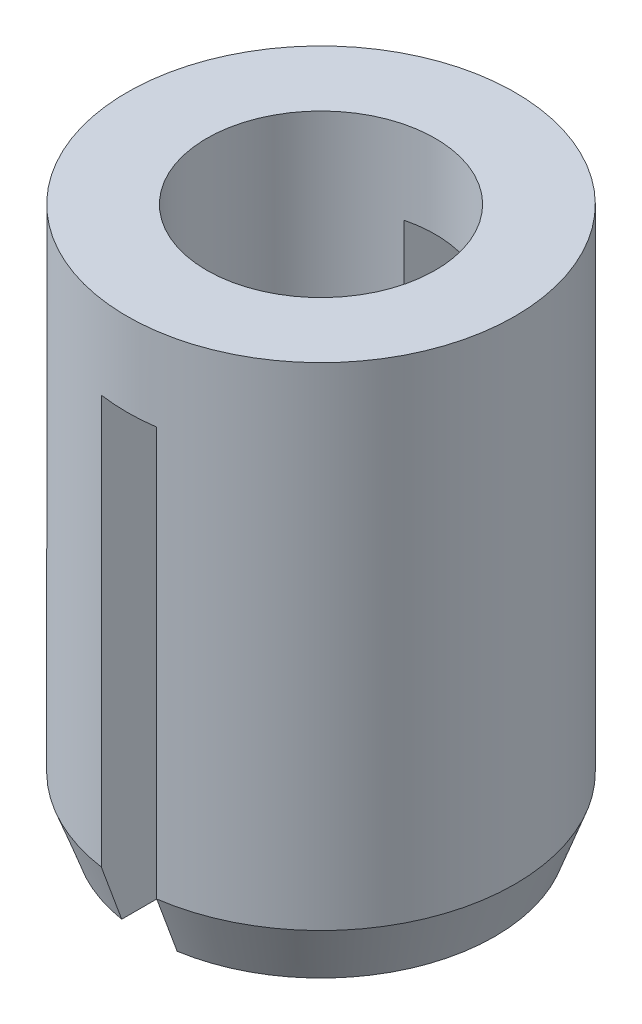
ISO-10303-21;
HEADER;
FILE_DESCRIPTION(('STEP AP214'),'2;1');
FILE_NAME('part.step','',(''),(''),'','','');
FILE_SCHEMA(('AUTOMOTIVE_DESIGN { 1 0 10303 214 1 1 1 1 }'));
ENDSEC;
DATA;
#1=APPLICATION_CONTEXT('core data for automotive mechanical design processes');
#2=APPLICATION_PROTOCOL_DEFINITION('international standard','automotive_design',2000,#1);
#3=PRODUCT_CONTEXT('',#1,'mechanical');
#4=PRODUCT('Part','Part','',(#3));
#5=PRODUCT_RELATED_PRODUCT_CATEGORY('part','',(#4));
#6=PRODUCT_DEFINITION_FORMATION('','',#4);
#7=PRODUCT_DEFINITION_CONTEXT('part definition',#1,'design');
#8=PRODUCT_DEFINITION('design','',#6,#7);
#9=PRODUCT_DEFINITION_SHAPE('','',#8);
#10=(LENGTH_UNIT() NAMED_UNIT(*) SI_UNIT(.MILLI.,.METRE.));
#11=(NAMED_UNIT(*) PLANE_ANGLE_UNIT() SI_UNIT($,.RADIAN.));
#12=(NAMED_UNIT(*) SI_UNIT($,.STERADIAN.) SOLID_ANGLE_UNIT());
#13=UNCERTAINTY_MEASURE_WITH_UNIT(LENGTH_MEASURE(1.E-05),#10,'distance_accuracy_value','');
#14=(GEOMETRIC_REPRESENTATION_CONTEXT(3) GLOBAL_UNCERTAINTY_ASSIGNED_CONTEXT((#13)) GLOBAL_UNIT_ASSIGNED_CONTEXT((#10,
#11,#12)) REPRESENTATION_CONTEXT('',''));
#15=CARTESIAN_POINT('',(0.,0.,0.));
#16=DIRECTION('',(0.,0.,1.));
#17=DIRECTION('',(1.,0.,0.));
#18=AXIS2_PLACEMENT_3D('',#15,#16,#17);
#19=CARTESIAN_POINT('',(-2.50882381258704,-7.9,0.));
#20=DIRECTION('',(0.,1.,0.));
#21=DIRECTION('',(-1.,0.,0.));
#22=AXIS2_PLACEMENT_3D('',#19,#20,#21);
#23=PLANE('',#22);
#24=CARTESIAN_POINT('',(0.,-7.9,0.));
#25=DIRECTION('',(0.,-1.,0.));
#26=DIRECTION('',(1.,0.,0.));
#27=AXIS2_PLACEMENT_3D('',#24,#25,#26);
#28=CIRCLE('',#27,2.50882381258704);
#29=CARTESIAN_POINT('',(0.399999999999999,-7.9,-2.47673109614341));
#30=VERTEX_POINT('',#29);
#31=CARTESIAN_POINT('',(0.399999999999999,-7.9,2.47673109614341));
#32=VERTEX_POINT('',#31);
#33=EDGE_CURVE('E202',#30,#32,#28,.T.);
#34=ORIENTED_EDGE('',*,*,#33,.T.);
#35=DIRECTION('',(0.,0.,1.));
#36=VECTOR('',#35,1.);
#37=CARTESIAN_POINT('',(0.399999999999999,-7.9,-2.8));
#38=LINE('',#37,#36);
#39=CARTESIAN_POINT('',(0.399999999999999,-7.9,1.60078105935821));
#40=VERTEX_POINT('',#39);
#41=EDGE_CURVE('E229',#40,#32,#38,.T.);
#42=ORIENTED_EDGE('',*,*,#41,.F.);
#43=CARTESIAN_POINT('',(0.,-7.9,0.));
#44=DIRECTION('',(0.,1.,0.));
#45=DIRECTION('',(0.,0.,1.));
#46=AXIS2_PLACEMENT_3D('',#43,#44,#45);
#47=CIRCLE('',#46,1.65);
#48=CARTESIAN_POINT('',(0.399999999999999,-7.9,-1.60078105935821));
#49=VERTEX_POINT('',#48);
#50=EDGE_CURVE('E199',#40,#49,#47,.T.);
#51=ORIENTED_EDGE('',*,*,#50,.T.);
#52=EDGE_CURVE('E146',#30,#49,#38,.T.);
#53=ORIENTED_EDGE('',*,*,#52,.F.);
#54=EDGE_LOOP('',(#34,#42,#51,#53));
#55=FACE_BOUND('',#54,.T.);
#56=ADVANCED_FACE('F34',(#55),#23,.F.);
#57=CARTESIAN_POINT('',(0.,-7.1,0.));
#58=DIRECTION('',(0.,1.,0.));
#59=DIRECTION('',(-1.,0.,0.));
#60=AXIS2_PLACEMENT_3D('',#57,#58,#59);
#61=CONICAL_SURFACE('',#60,2.8,0.349065850398867);
#62=ORIENTED_EDGE('',*,*,#33,.F.);
#63=CARTESIAN_POINT('',(0.399999999999999,-11.2902425301862,-1.21049987572844));
#64=CARTESIAN_POINT('',(0.399999999999999,-11.142393584403,-1.26715678151961));
#65=CARTESIAN_POINT('',(0.399999999999999,-10.9944265774838,-1.3235039397798));
#66=CARTESIAN_POINT('',(0.399999999999999,-10.6983145074577,-1.43572690812839));
#67=CARTESIAN_POINT('',(0.399999999999999,-10.5501694450572,-1.49160272007944));
#68=CARTESIAN_POINT('',(0.399999999999999,-10.2537594750589,-1.60303109405058));
#69=CARTESIAN_POINT('',(0.399999999999999,-10.105494568536,-1.65858365893418));
#70=CARTESIAN_POINT('',(0.399999999999999,-9.80887375463946,-1.7694457720518));
#71=CARTESIAN_POINT('',(0.399999999999999,-9.66051784716191,-1.82475532000781));
#72=CARTESIAN_POINT('',(0.399999999999999,-9.20546401976979,-1.99409084875607));
#73=CARTESIAN_POINT('',(0.399999999999999,-8.89865595146435,-2.10782073638575));
#74=CARTESIAN_POINT('',(0.399999999999999,-8.28486495521757,-2.33481172956583));
#75=CARTESIAN_POINT('',(0.399999999999999,-7.97788202643299,-2.44807283283343));
#76=CARTESIAN_POINT('',(0.399999999999999,-7.06666860977324,-2.78375419035035));
#77=CARTESIAN_POINT('',(0.399999999999999,-6.46227805906065,-3.00573985566537));
#78=CARTESIAN_POINT('',(0.399999999999999,-5.55553772627782,-3.33828475165868));
#79=CARTESIAN_POINT('',(0.399999999999999,-5.2532670806402,-3.44906009474859));
#80=CARTESIAN_POINT('',(0.4,-4.64868392107793,-3.67049617271375));
#81=CARTESIAN_POINT('',(0.4,-4.34637140716681,-3.78115690762593));
#82=CARTESIAN_POINT('',(0.4,-4.04404330547682,-3.89177510511057));
#83=B_SPLINE_CURVE_WITH_KNOTS('',3,(#63,#64,#65,#66,#67,#68,#69,#70,#71,#72,#73,#74,#75,#76,#77,
#78,#79,#80,#81,#82),.UNSPECIFIED.,.F.,.F.,(4,2,2,2,2,2,2,2,2,4),(0.,0.474997586805865,
0.949993295653429,1.42498479030659,1.89997682821062,2.88160284163605,3.86323362961476,
5.79483579816111,6.76062485230251,7.72641359515019),.UNSPECIFIED.);
#84=CARTESIAN_POINT('',(0.399999999999999,-7.1,-2.7712812921102));
#85=VERTEX_POINT('',#84);
#86=EDGE_CURVE('E187',#30,#85,#83,.T.);
#87=ORIENTED_EDGE('',*,*,#86,.T.);
#88=CARTESIAN_POINT('',(0.,-7.1,0.));
#89=DIRECTION('',(0.,-1.,0.));
#90=DIRECTION('',(1.,0.,0.));
#91=AXIS2_PLACEMENT_3D('',#88,#89,#90);
#92=CIRCLE('',#91,2.8);
#93=CARTESIAN_POINT('',(0.399999999999999,-7.1,2.7712812921102));
#94=VERTEX_POINT('',#93);
#95=EDGE_CURVE('E206',#85,#94,#92,.T.);
#96=ORIENTED_EDGE('',*,*,#95,.T.);
#97=CARTESIAN_POINT('',(0.4,-4.04404330547682,3.89177510511057));
#98=CARTESIAN_POINT('',(0.4,-4.64869612104239,3.6705103080676));
#99=CARTESIAN_POINT('',(0.399999999999999,-5.25330602267686,3.44912762135537));
#100=CARTESIAN_POINT('',(0.399999999999999,-6.16004535350742,3.11658294354642));
#101=CARTESIAN_POINT('',(0.399999999999999,-6.46226128712741,3.0056567385803));
#102=CARTESIAN_POINT('',(0.399999999999999,-7.06661768895054,2.78359790668099));
#103=CARTESIAN_POINT('',(0.399999999999999,-7.36875815707629,2.67246527953709));
#104=CARTESIAN_POINT('',(0.399999999999999,-7.97293205234622,2.4498986766404));
#105=CARTESIAN_POINT('',(0.399999999999999,-8.27496547821825,2.33846469743359));
#106=CARTESIAN_POINT('',(0.399999999999999,-8.87886552559265,2.11514738972155));
#107=CARTESIAN_POINT('',(0.399999999999999,-9.18073214749174,2.00326406229032));
#108=CARTESIAN_POINT('',(0.399999999999999,-9.63332821975423,1.83488592060947));
#109=CARTESIAN_POINT('',(0.399999999999999,-9.78416041662047,1.77866737570373));
#110=CARTESIAN_POINT('',(0.399999999999999,-10.0857321554608,1.66598279816256));
#111=CARTESIAN_POINT('',(0.399999999999999,-10.236471697542,1.60951676581382));
#112=CARTESIAN_POINT('',(0.399999999999999,-10.5378282289336,1.49625438318297));
#113=CARTESIAN_POINT('',(0.399999999999999,-10.6884452172262,1.43945803018869));
#114=CARTESIAN_POINT('',(0.399999999999999,-10.9894962120502,1.32538085051895));
#115=CARTESIAN_POINT('',(0.399999999999999,-11.1399302178407,1.26810002188932));
#116=CARTESIAN_POINT('',(0.399999999999999,-11.2902425301862,1.21049987572844));
#117=B_SPLINE_CURVE_WITH_KNOTS('',3,(#97,#98,#99,#100,#101,#102,#103,#104,#105,#106,#107,#108,
#109,#110,#111,#112,#113,#114,#115,#116),.UNSPECIFIED.,.F.,.F.,(4,2,2,2,2,2,2,2,2,4),(0.,
1.9315975649845,2.89738831511378,3.86318005166654,4.82898290519797,5.79478345171652,
6.2776889549052,6.76059389884722,7.24350281338222,7.72641367669272),.UNSPECIFIED.);
#118=EDGE_CURVE('E131',#94,#32,#117,.T.);
#119=ORIENTED_EDGE('',*,*,#118,.T.);
#120=EDGE_LOOP('',(#62,#87,#96,#119));
#121=FACE_BOUND('',#120,.T.);
#122=ADVANCED_FACE('F250',(#121),#61,.T.);
#123=CARTESIAN_POINT('',(-0.399999999999999,-7.9,2.47673109614341));
#124=VERTEX_POINT('',#123);
#125=CARTESIAN_POINT('',(-0.399999999999999,-7.9,-2.47673109614341));
#126=VERTEX_POINT('',#125);
#127=EDGE_CURVE('E205',#124,#126,#28,.T.);
#128=ORIENTED_EDGE('',*,*,#127,.T.);
#129=DIRECTION('',(0.,0.,1.));
#130=VECTOR('',#129,1.);
#131=CARTESIAN_POINT('',(-0.399999999999999,-7.9,-2.8));
#132=LINE('',#131,#130);
#133=CARTESIAN_POINT('',(-0.399999999999999,-7.9,-1.60078105935821));
#134=VERTEX_POINT('',#133);
#135=EDGE_CURVE('E139',#126,#134,#132,.T.);
#136=ORIENTED_EDGE('',*,*,#135,.T.);
#137=CARTESIAN_POINT('',(-0.399999999999999,-7.9,1.60078105935821));
#138=VERTEX_POINT('',#137);
#139=EDGE_CURVE('E198',#134,#138,#47,.T.);
#140=ORIENTED_EDGE('',*,*,#139,.T.);
#141=EDGE_CURVE('E136',#138,#124,#132,.T.);
#142=ORIENTED_EDGE('',*,*,#141,.T.);
#143=EDGE_LOOP('',(#128,#136,#140,#142));
#144=FACE_BOUND('',#143,.T.);
#145=ADVANCED_FACE('F36',(#144),#23,.F.);
#146=CARTESIAN_POINT('',(0.,0.,0.));
#147=DIRECTION('',(0.,-1.,0.));
#148=DIRECTION('',(1.,0.,0.));
#149=AXIS2_PLACEMENT_3D('',#146,#147,#148);
#150=PLANE('',#149);
#151=CARTESIAN_POINT('',(0.,0.,0.));
#152=DIRECTION('',(0.,1.,0.));
#153=DIRECTION('',(0.,0.,1.));
#154=AXIS2_PLACEMENT_3D('',#151,#152,#153);
#155=CIRCLE('',#154,1.65);
#156=CARTESIAN_POINT('',(0.,0.,1.65));
#157=VERTEX_POINT('',#156);
#158=EDGE_CURVE('E195',#157,#157,#155,.T.);
#159=ORIENTED_EDGE('',*,*,#158,.F.);
#160=EDGE_LOOP('',(#159));
#161=FACE_BOUND('',#160,.T.);
#162=CARTESIAN_POINT('',(0.,0.,0.));
#163=DIRECTION('',(0.,-1.,0.));
#164=DIRECTION('',(1.,0.,0.));
#165=AXIS2_PLACEMENT_3D('',#162,#163,#164);
#166=CIRCLE('',#165,2.8);
#167=CARTESIAN_POINT('',(2.80000000000001,0.,0.));
#168=VERTEX_POINT('',#167);
#169=EDGE_CURVE('E210',#168,#168,#166,.T.);
#170=ORIENTED_EDGE('',*,*,#169,.F.);
#171=EDGE_LOOP('',(#170));
#172=FACE_BOUND('',#171,.T.);
#173=ADVANCED_FACE('F256',(#161,#172),#150,.F.);
#174=CARTESIAN_POINT('',(0.,-7.9,0.));
#175=DIRECTION('',(0.,-1.,0.));
#176=DIRECTION('',(1.,0.,0.));
#177=AXIS2_PLACEMENT_3D('',#174,#175,#176);
#178=CYLINDRICAL_SURFACE('',#177,2.8);
#179=CARTESIAN_POINT('',(0.,-1.2,0.));
#180=DIRECTION('',(0.,1.,0.));
#181=DIRECTION('',(0.,0.,1.));
#182=AXIS2_PLACEMENT_3D('',#179,#180,#181);
#183=CIRCLE('',#182,2.8);
#184=CARTESIAN_POINT('',(-0.4,-1.2,2.77128129211021));
#185=VERTEX_POINT('',#184);
#186=CARTESIAN_POINT('',(0.4,-1.2,2.77128129211021));
#187=VERTEX_POINT('',#186);
#188=EDGE_CURVE('E122',#185,#187,#183,.T.);
#189=ORIENTED_EDGE('',*,*,#188,.T.);
#190=DIRECTION('',(0.,-1.,0.));
#191=VECTOR('',#190,1.);
#192=CARTESIAN_POINT('',(0.399999999999999,-7.9,2.77128129211021));
#193=LINE('',#192,#191);
#194=EDGE_CURVE('E179',#187,#94,#193,.T.);
#195=ORIENTED_EDGE('',*,*,#194,.T.);
#196=ORIENTED_EDGE('',*,*,#95,.F.);
#197=DIRECTION('',(0.,-1.,0.));
#198=VECTOR('',#197,1.);
#199=CARTESIAN_POINT('',(0.399999999999999,-7.9,-2.77128129211021));
#200=LINE('',#199,#198);
#201=CARTESIAN_POINT('',(0.4,-1.2,-2.77128129211021));
#202=VERTEX_POINT('',#201);
#203=EDGE_CURVE('E119',#85,#202,#200,.F.);
#204=ORIENTED_EDGE('',*,*,#203,.T.);
#205=CARTESIAN_POINT('',(-0.4,-1.2,-2.77128129211021));
#206=VERTEX_POINT('',#205);
#207=EDGE_CURVE('E111',#202,#206,#183,.T.);
#208=ORIENTED_EDGE('',*,*,#207,.T.);
#209=DIRECTION('',(0.,-1.,0.));
#210=VECTOR('',#209,1.);
#211=CARTESIAN_POINT('',(-0.399999999999999,-7.9,-2.77128129211021));
#212=LINE('',#211,#210);
#213=CARTESIAN_POINT('',(-0.399999999999999,-7.1,-2.7712812921102));
#214=VERTEX_POINT('',#213);
#215=EDGE_CURVE('E116',#206,#214,#212,.T.);
#216=ORIENTED_EDGE('',*,*,#215,.T.);
#217=CARTESIAN_POINT('',(-0.399999999999999,-7.1,2.7712812921102));
#218=VERTEX_POINT('',#217);
#219=EDGE_CURVE('E209',#218,#214,#92,.T.);
#220=ORIENTED_EDGE('',*,*,#219,.F.);
#221=DIRECTION('',(0.,-1.,0.));
#222=VECTOR('',#221,1.);
#223=CARTESIAN_POINT('',(-0.399999999999999,-7.9,2.77128129211021));
#224=LINE('',#223,#222);
#225=EDGE_CURVE('E155',#218,#185,#224,.F.);
#226=ORIENTED_EDGE('',*,*,#225,.T.);
#227=EDGE_LOOP('',(#189,#195,#196,#204,#208,#216,#220,#226));
#228=FACE_BOUND('',#227,.T.);
#229=ORIENTED_EDGE('',*,*,#169,.T.);
#230=EDGE_LOOP('',(#229));
#231=FACE_BOUND('',#230,.T.);
#232=ADVANCED_FACE('F113',(#228,#231),#178,.T.);
#233=ORIENTED_EDGE('',*,*,#219,.T.);
#234=CARTESIAN_POINT('',(-0.4,-4.04404330547682,-3.89177510511057));
#235=CARTESIAN_POINT('',(-0.4,-4.64869612104239,-3.6705103080676));
#236=CARTESIAN_POINT('',(-0.399999999999999,-5.25330602267685,-3.44912762135537));
#237=CARTESIAN_POINT('',(-0.399999999999999,-6.16004535350742,-3.11658294354642));
#238=CARTESIAN_POINT('',(-0.399999999999999,-6.46226128712741,-3.0056567385803));
#239=CARTESIAN_POINT('',(-0.399999999999999,-7.06661768895054,-2.78359790668099));
#240=CARTESIAN_POINT('',(-0.399999999999999,-7.36875815707629,-2.67246527953709));
#241=CARTESIAN_POINT('',(-0.399999999999999,-7.97293205234622,-2.4498986766404));
#242=CARTESIAN_POINT('',(-0.399999999999999,-8.27496547821825,-2.33846469743359));
#243=CARTESIAN_POINT('',(-0.399999999999999,-8.87886552559265,-2.11514738972155));
#244=CARTESIAN_POINT('',(-0.399999999999999,-9.18073214749174,-2.00326406229032));
#245=CARTESIAN_POINT('',(-0.399999999999999,-9.63332821975423,-1.83488592060947));
#246=CARTESIAN_POINT('',(-0.399999999999999,-9.78416041662047,-1.77866737570373));
#247=CARTESIAN_POINT('',(-0.399999999999999,-10.0857321554608,-1.66598279816256));
#248=CARTESIAN_POINT('',(-0.399999999999999,-10.236471697542,-1.60951676581382));
#249=CARTESIAN_POINT('',(-0.399999999999999,-10.5378282289336,-1.49625438318297));
#250=CARTESIAN_POINT('',(-0.399999999999999,-10.6884452172262,-1.43945803018869));
#251=CARTESIAN_POINT('',(-0.399999999999999,-10.9894962120502,-1.32538085051895));
#252=CARTESIAN_POINT('',(-0.399999999999999,-11.1399302178407,-1.26810002188932));
#253=CARTESIAN_POINT('',(-0.399999999999999,-11.2902425301862,-1.21049987572844));
#254=B_SPLINE_CURVE_WITH_KNOTS('',3,(#234,#235,#236,#237,#238,#239,#240,#241,#242,#243,#244,
#245,#246,#247,#248,#249,#250,#251,#252,#253),.UNSPECIFIED.,.F.,.F.,(4,2,2,2,2,2,2,2,2,4),(0.,
1.9315975649845,2.89738831511378,3.86318005166654,4.82898290519797,5.79478345171653,
6.2776889549052,6.76059389884723,7.24350281338223,7.72641367669273),.UNSPECIFIED.);
#255=EDGE_CURVE('E130',#214,#126,#254,.T.);
#256=ORIENTED_EDGE('',*,*,#255,.T.);
#257=ORIENTED_EDGE('',*,*,#127,.F.);
#258=CARTESIAN_POINT('',(-0.399999999999999,-11.2902425301862,1.21049987572844));
#259=CARTESIAN_POINT('',(-0.399999999999999,-11.142393584403,1.26715678151961));
#260=CARTESIAN_POINT('',(-0.399999999999999,-10.9944265774838,1.3235039397798));
#261=CARTESIAN_POINT('',(-0.399999999999999,-10.6983145074577,1.43572690812839));
#262=CARTESIAN_POINT('',(-0.399999999999999,-10.5501694450572,1.49160272007944));
#263=CARTESIAN_POINT('',(-0.399999999999999,-10.2537594750589,1.60303109405058));
#264=CARTESIAN_POINT('',(-0.399999999999999,-10.105494568536,1.65858365893418));
#265=CARTESIAN_POINT('',(-0.399999999999999,-9.80887375463946,1.7694457720518));
#266=CARTESIAN_POINT('',(-0.399999999999999,-9.66051784716191,1.82475532000781));
#267=CARTESIAN_POINT('',(-0.399999999999999,-9.2054640197698,1.99409084875607));
#268=CARTESIAN_POINT('',(-0.399999999999999,-8.89865595146435,2.10782073638575));
#269=CARTESIAN_POINT('',(-0.399999999999999,-8.28486495521757,2.33481172956583));
#270=CARTESIAN_POINT('',(-0.399999999999999,-7.97788202643299,2.44807283283342));
#271=CARTESIAN_POINT('',(-0.399999999999999,-7.06666860977324,2.78375419035035));
#272=CARTESIAN_POINT('',(-0.399999999999999,-6.46227805906064,3.00573985566537));
#273=CARTESIAN_POINT('',(-0.399999999999999,-5.55553772627781,3.33828475165868));
#274=CARTESIAN_POINT('',(-0.399999999999999,-5.2532670806402,3.44906009474859));
#275=CARTESIAN_POINT('',(-0.4,-4.64868392107793,3.67049617271375));
#276=CARTESIAN_POINT('',(-0.4,-4.34637140716681,3.78115690762593));
#277=CARTESIAN_POINT('',(-0.4,-4.04404330547682,3.89177510511057));
#278=B_SPLINE_CURVE_WITH_KNOTS('',3,(#258,#259,#260,#261,#262,#263,#264,#265,#266,#267,#268,
#269,#270,#271,#272,#273,#274,#275,#276,#277),.UNSPECIFIED.,.F.,.F.,(4,2,2,2,2,2,2,2,2,4),(0.,
0.474997586805867,0.949993295653429,1.42498479030659,1.89997682821062,2.88160284163605,
3.86323362961476,5.79483579816111,6.76062485230252,7.72641359515019),.UNSPECIFIED.);
#279=EDGE_CURVE('E121',#124,#218,#278,.T.);
#280=ORIENTED_EDGE('',*,*,#279,.T.);
#281=EDGE_LOOP('',(#233,#256,#257,#280));
#282=FACE_BOUND('',#281,.T.);
#283=ADVANCED_FACE('F157',(#282),#61,.T.);
#284=CARTESIAN_POINT('',(0.,0.,0.));
#285=DIRECTION('',(0.,1.,0.));
#286=DIRECTION('',(0.,0.,1.));
#287=AXIS2_PLACEMENT_3D('',#284,#285,#286);
#288=CYLINDRICAL_SURFACE('',#287,1.65);
#289=CARTESIAN_POINT('',(0.,-1.2,0.));
#290=DIRECTION('',(0.,1.,0.));
#291=DIRECTION('',(0.,0.,1.));
#292=AXIS2_PLACEMENT_3D('',#289,#290,#291);
#293=CIRCLE('',#292,1.65);
#294=CARTESIAN_POINT('',(-0.4,-1.2,-1.60078105935821));
#295=VERTEX_POINT('',#294);
#296=CARTESIAN_POINT('',(0.4,-1.2,-1.60078105935821));
#297=VERTEX_POINT('',#296);
#298=EDGE_CURVE('E135',#295,#297,#293,.F.);
#299=ORIENTED_EDGE('',*,*,#298,.T.);
#300=DIRECTION('',(0.,1.,0.));
#301=VECTOR('',#300,1.);
#302=CARTESIAN_POINT('',(0.4,0.,-1.60078105935821));
#303=LINE('',#302,#301);
#304=EDGE_CURVE('E11',#297,#49,#303,.F.);
#305=ORIENTED_EDGE('',*,*,#304,.T.);
#306=ORIENTED_EDGE('',*,*,#50,.F.);
#307=DIRECTION('',(0.,1.,0.));
#308=VECTOR('',#307,1.);
#309=CARTESIAN_POINT('',(0.4,0.,1.60078105935821));
#310=LINE('',#309,#308);
#311=CARTESIAN_POINT('',(0.4,-1.2,1.60078105935821));
#312=VERTEX_POINT('',#311);
#313=EDGE_CURVE('E219',#40,#312,#310,.T.);
#314=ORIENTED_EDGE('',*,*,#313,.T.);
#315=CARTESIAN_POINT('',(-0.4,-1.2,1.60078105935821));
#316=VERTEX_POINT('',#315);
#317=EDGE_CURVE('E213',#312,#316,#293,.F.);
#318=ORIENTED_EDGE('',*,*,#317,.T.);
#319=DIRECTION('',(0.,1.,0.));
#320=VECTOR('',#319,1.);
#321=CARTESIAN_POINT('',(-0.4,0.,1.60078105935821));
#322=LINE('',#321,#320);
#323=EDGE_CURVE('E216',#316,#138,#322,.F.);
#324=ORIENTED_EDGE('',*,*,#323,.T.);
#325=ORIENTED_EDGE('',*,*,#139,.F.);
#326=DIRECTION('',(0.,1.,0.));
#327=VECTOR('',#326,1.);
#328=CARTESIAN_POINT('',(-0.4,0.,-1.60078105935821));
#329=LINE('',#328,#327);
#330=EDGE_CURVE('E42',#134,#295,#329,.T.);
#331=ORIENTED_EDGE('',*,*,#330,.T.);
#332=EDGE_LOOP('',(#299,#305,#306,#314,#318,#324,#325,#331));
#333=FACE_BOUND('',#332,.T.);
#334=ORIENTED_EDGE('',*,*,#158,.T.);
#335=EDGE_LOOP('',(#334));
#336=FACE_BOUND('',#335,.T.);
#337=ADVANCED_FACE('F185',(#333,#336),#288,.F.);
#338=CARTESIAN_POINT('',(0.4,-1.2,-2.8));
#339=DIRECTION('',(0.,1.,0.));
#340=DIRECTION('',(0.,0.,1.));
#341=AXIS2_PLACEMENT_3D('',#338,#339,#340);
#342=PLANE('',#341);
#343=ORIENTED_EDGE('',*,*,#188,.F.);
#344=DIRECTION('',(0.,0.,1.));
#345=VECTOR('',#344,1.);
#346=CARTESIAN_POINT('',(-0.4,-1.2,-2.8));
#347=LINE('',#346,#345);
#348=EDGE_CURVE('E57',#316,#185,#347,.T.);
#349=ORIENTED_EDGE('',*,*,#348,.F.);
#350=ORIENTED_EDGE('',*,*,#317,.F.);
#351=DIRECTION('',(0.,0.,1.));
#352=VECTOR('',#351,1.);
#353=CARTESIAN_POINT('',(0.4,-1.2,-2.8));
#354=LINE('',#353,#352);
#355=EDGE_CURVE('E143',#312,#187,#354,.T.);
#356=ORIENTED_EDGE('',*,*,#355,.T.);
#357=EDGE_LOOP('',(#343,#349,#350,#356));
#358=FACE_BOUND('',#357,.T.);
#359=ADVANCED_FACE('F242',(#358),#342,.F.);
#360=CARTESIAN_POINT('',(-0.4,-1.2,-2.8));
#361=DIRECTION('',(-1.,0.,0.));
#362=DIRECTION('',(0.,-1.,0.));
#363=AXIS2_PLACEMENT_3D('',#360,#361,#362);
#364=PLANE('',#363);
#365=ORIENTED_EDGE('',*,*,#279,.F.);
#366=ORIENTED_EDGE('',*,*,#141,.F.);
#367=ORIENTED_EDGE('',*,*,#323,.F.);
#368=ORIENTED_EDGE('',*,*,#348,.T.);
#369=ORIENTED_EDGE('',*,*,#225,.F.);
#370=EDGE_LOOP('',(#365,#366,#367,#368,#369));
#371=FACE_BOUND('',#370,.T.);
#372=ADVANCED_FACE('F165',(#371),#364,.F.);
#373=CARTESIAN_POINT('',(0.4,-1.2,-2.8));
#374=DIRECTION('',(1.,0.,0.));
#375=DIRECTION('',(0.,1.,0.));
#376=AXIS2_PLACEMENT_3D('',#373,#374,#375);
#377=PLANE('',#376);
#378=ORIENTED_EDGE('',*,*,#355,.F.);
#379=ORIENTED_EDGE('',*,*,#313,.F.);
#380=ORIENTED_EDGE('',*,*,#41,.T.);
#381=ORIENTED_EDGE('',*,*,#118,.F.);
#382=ORIENTED_EDGE('',*,*,#194,.F.);
#383=EDGE_LOOP('',(#378,#379,#380,#381,#382));
#384=FACE_BOUND('',#383,.T.);
#385=ADVANCED_FACE('F183',(#384),#377,.F.);
#386=ORIENTED_EDGE('',*,*,#86,.F.);
#387=ORIENTED_EDGE('',*,*,#52,.T.);
#388=ORIENTED_EDGE('',*,*,#304,.F.);
#389=EDGE_CURVE('E49',#202,#297,#354,.T.);
#390=ORIENTED_EDGE('',*,*,#389,.F.);
#391=ORIENTED_EDGE('',*,*,#203,.F.);
#392=EDGE_LOOP('',(#386,#387,#388,#390,#391));
#393=FACE_BOUND('',#392,.T.);
#394=ADVANCED_FACE('F164',(#393),#377,.F.);
#395=EDGE_CURVE('E127',#206,#295,#347,.T.);
#396=ORIENTED_EDGE('',*,*,#395,.T.);
#397=ORIENTED_EDGE('',*,*,#330,.F.);
#398=ORIENTED_EDGE('',*,*,#135,.F.);
#399=ORIENTED_EDGE('',*,*,#255,.F.);
#400=ORIENTED_EDGE('',*,*,#215,.F.);
#401=EDGE_LOOP('',(#396,#397,#398,#399,#400));
#402=FACE_BOUND('',#401,.T.);
#403=ADVANCED_FACE('F126',(#402),#364,.F.);
#404=ORIENTED_EDGE('',*,*,#389,.T.);
#405=ORIENTED_EDGE('',*,*,#298,.F.);
#406=ORIENTED_EDGE('',*,*,#395,.F.);
#407=ORIENTED_EDGE('',*,*,#207,.F.);
#408=EDGE_LOOP('',(#404,#405,#406,#407));
#409=FACE_BOUND('',#408,.T.);
#410=ADVANCED_FACE('F133',(#409),#342,.F.);
#411=CLOSED_SHELL('',(#56,#122,#145,#173,#232,#283,#337,#359,#372,#385,#394,#403,#410));
#412=MANIFOLD_SOLID_BREP('B2',#411);
#413=ADVANCED_BREP_SHAPE_REPRESENTATION('',(#18,#412),#14);
#414=SHAPE_DEFINITION_REPRESENTATION(#9,#413);
ENDSEC;
END-ISO-10303-21;
